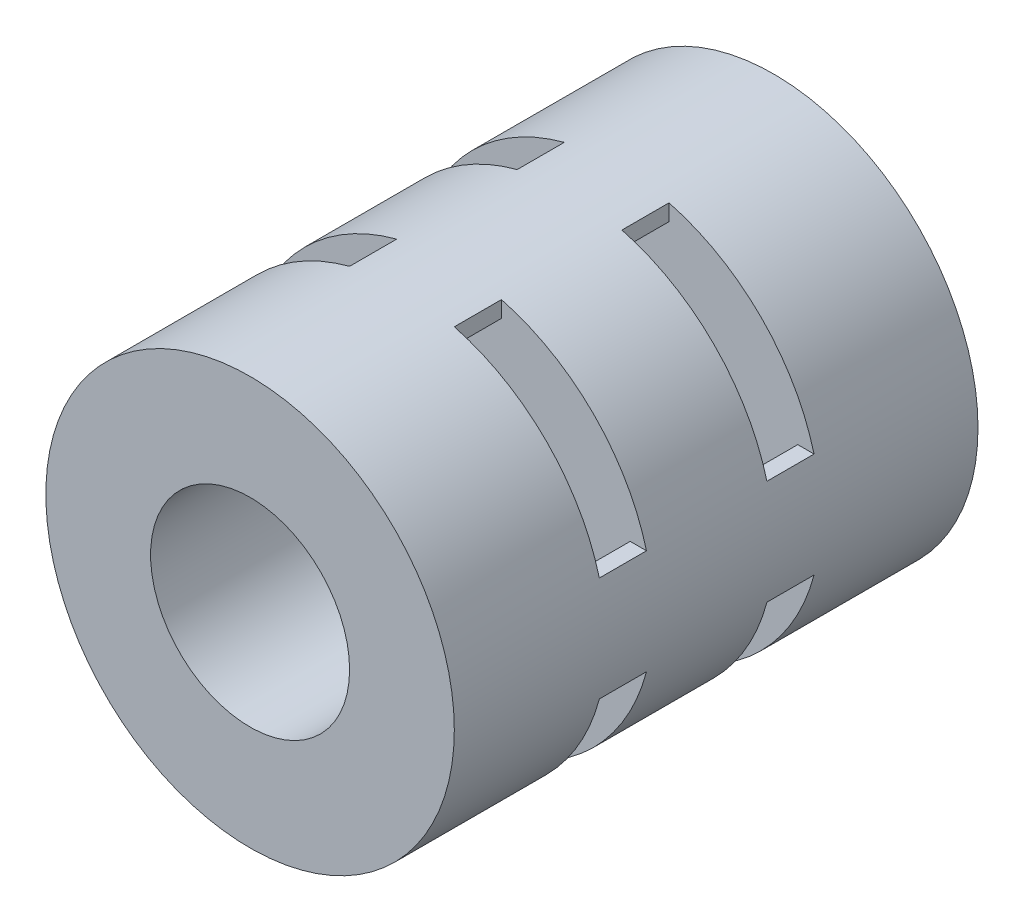
ISO-10303-21;
HEADER;
FILE_DESCRIPTION(('STEP AP214'),'2;1');
FILE_NAME('part.step','',(''),(''),'','','');
FILE_SCHEMA(('AUTOMOTIVE_DESIGN { 1 0 10303 214 1 1 1 1 }'));
ENDSEC;
DATA;
#1=APPLICATION_CONTEXT('core data for automotive mechanical design processes');
#2=APPLICATION_PROTOCOL_DEFINITION('international standard','automotive_design',2000,#1);
#3=PRODUCT_CONTEXT('',#1,'mechanical');
#4=PRODUCT('Part','Part','',(#3));
#5=PRODUCT_RELATED_PRODUCT_CATEGORY('part','',(#4));
#6=PRODUCT_DEFINITION_FORMATION('','',#4);
#7=PRODUCT_DEFINITION_CONTEXT('part definition',#1,'design');
#8=PRODUCT_DEFINITION('design','',#6,#7);
#9=PRODUCT_DEFINITION_SHAPE('','',#8);
#10=(LENGTH_UNIT() NAMED_UNIT(*) SI_UNIT(.MILLI.,.METRE.));
#11=(NAMED_UNIT(*) PLANE_ANGLE_UNIT() SI_UNIT($,.RADIAN.));
#12=(NAMED_UNIT(*) SI_UNIT($,.STERADIAN.) SOLID_ANGLE_UNIT());
#13=UNCERTAINTY_MEASURE_WITH_UNIT(LENGTH_MEASURE(1.E-05),#10,'distance_accuracy_value','');
#14=(GEOMETRIC_REPRESENTATION_CONTEXT(3) GLOBAL_UNCERTAINTY_ASSIGNED_CONTEXT((#13)) GLOBAL_UNIT_ASSIGNED_CONTEXT((#10,
#11,#12)) REPRESENTATION_CONTEXT('',''));
#15=CARTESIAN_POINT('',(0.,0.,0.));
#16=DIRECTION('',(0.,0.,1.));
#17=DIRECTION('',(1.,0.,0.));
#18=AXIS2_PLACEMENT_3D('',#15,#16,#17);
#19=CARTESIAN_POINT('',(0.,0.,15.));
#20=DIRECTION('',(0.,0.,1.));
#21=DIRECTION('',(1.,0.,0.));
#22=AXIS2_PLACEMENT_3D('',#19,#20,#21);
#23=PLANE('',#22);
#24=CARTESIAN_POINT('',(0.,0.,15.));
#25=DIRECTION('',(0.,0.,1.));
#26=DIRECTION('',(1.,0.,0.));
#27=AXIS2_PLACEMENT_3D('',#24,#25,#26);
#28=CIRCLE('',#27,6.);
#29=CARTESIAN_POINT('',(6.,0.,15.));
#30=VERTEX_POINT('',#29);
#31=EDGE_CURVE('E896',#30,#30,#28,.T.);
#32=ORIENTED_EDGE('',*,*,#31,.F.);
#33=EDGE_LOOP('',(#32));
#34=FACE_BOUND('',#33,.T.);
#35=CARTESIAN_POINT('',(0.,0.,15.));
#36=DIRECTION('',(0.,0.,1.));
#37=DIRECTION('',(1.,0.,0.));
#38=AXIS2_PLACEMENT_3D('',#35,#36,#37);
#39=CIRCLE('',#38,19.5);
#40=CARTESIAN_POINT('',(18.8480768249708,5.,15.));
#41=VERTEX_POINT('',#40);
#42=CARTESIAN_POINT('',(5.00000000000007,18.8480768249708,15.));
#43=VERTEX_POINT('',#42);
#44=EDGE_CURVE('E11',#41,#43,#39,.T.);
#45=ORIENTED_EDGE('',*,*,#44,.T.);
#46=DIRECTION('',(0.,1.,0.));
#47=VECTOR('',#46,1.);
#48=CARTESIAN_POINT('',(5.00000000000006,17.2916164657905,15.));
#49=LINE('',#48,#47);
#50=CARTESIAN_POINT('',(5.00000000000006,17.2916164657905,15.));
#51=VERTEX_POINT('',#50);
#52=EDGE_CURVE('E755',#51,#43,#49,.T.);
#53=ORIENTED_EDGE('',*,*,#52,.F.);
#54=CARTESIAN_POINT('',(0.,0.,15.));
#55=DIRECTION('',(0.,0.,-1.));
#56=DIRECTION('',(0.,-1.,0.));
#57=AXIS2_PLACEMENT_3D('',#54,#55,#56);
#58=CIRCLE('',#57,18.);
#59=CARTESIAN_POINT('',(-4.99999999999994,17.2916164657906,15.));
#60=VERTEX_POINT('',#59);
#61=EDGE_CURVE('E752',#60,#51,#58,.T.);
#62=ORIENTED_EDGE('',*,*,#61,.F.);
#63=DIRECTION('',(0.,-1.,0.));
#64=VECTOR('',#63,1.);
#65=CARTESIAN_POINT('',(-4.99999999999994,17.2916164657906,15.));
#66=LINE('',#65,#64);
#67=CARTESIAN_POINT('',(-4.99999999999993,18.8480768249708,15.));
#68=VERTEX_POINT('',#67);
#69=EDGE_CURVE('E745',#68,#60,#66,.T.);
#70=ORIENTED_EDGE('',*,*,#69,.F.);
#71=CARTESIAN_POINT('',(-18.8480768249708,5.,15.));
#72=VERTEX_POINT('',#71);
#73=EDGE_CURVE('E27',#68,#72,#39,.T.);
#74=ORIENTED_EDGE('',*,*,#73,.T.);
#75=DIRECTION('',(-1.,0.,0.));
#76=VECTOR('',#75,1.);
#77=CARTESIAN_POINT('',(-17.2916164657906,5.,15.));
#78=LINE('',#77,#76);
#79=CARTESIAN_POINT('',(-17.2916164657906,5.,15.));
#80=VERTEX_POINT('',#79);
#81=EDGE_CURVE('E815',#80,#72,#78,.T.);
#82=ORIENTED_EDGE('',*,*,#81,.F.);
#83=CARTESIAN_POINT('',(0.,0.,15.));
#84=DIRECTION('',(0.,0.,-1.));
#85=DIRECTION('',(1.,0.,0.));
#86=AXIS2_PLACEMENT_3D('',#83,#84,#85);
#87=CIRCLE('',#86,18.);
#88=CARTESIAN_POINT('',(-17.2916164657906,-5.,15.));
#89=VERTEX_POINT('',#88);
#90=EDGE_CURVE('E801',#89,#80,#87,.T.);
#91=ORIENTED_EDGE('',*,*,#90,.F.);
#92=DIRECTION('',(1.,0.,0.));
#93=VECTOR('',#92,1.);
#94=CARTESIAN_POINT('',(-17.2916164657906,-5.,15.));
#95=LINE('',#94,#93);
#96=CARTESIAN_POINT('',(-18.8480768249708,-5.,15.));
#97=VERTEX_POINT('',#96);
#98=EDGE_CURVE('E806',#97,#89,#95,.T.);
#99=ORIENTED_EDGE('',*,*,#98,.F.);
#100=CARTESIAN_POINT('',(-5.00000000000007,-18.8480768249708,15.));
#101=VERTEX_POINT('',#100);
#102=EDGE_CURVE('E869',#97,#101,#39,.T.);
#103=ORIENTED_EDGE('',*,*,#102,.T.);
#104=DIRECTION('',(0.,-1.,0.));
#105=VECTOR('',#104,1.);
#106=CARTESIAN_POINT('',(-5.00000000000007,-18.8480768249708,15.));
#107=LINE('',#106,#105);
#108=CARTESIAN_POINT('',(-5.00000000000006,-17.2916164657905,15.));
#109=VERTEX_POINT('',#108);
#110=EDGE_CURVE('E785',#109,#101,#107,.T.);
#111=ORIENTED_EDGE('',*,*,#110,.F.);
#112=CARTESIAN_POINT('',(0.,0.,15.));
#113=DIRECTION('',(0.,0.,-1.));
#114=DIRECTION('',(0.,-1.,0.));
#115=AXIS2_PLACEMENT_3D('',#112,#113,#114);
#116=CIRCLE('',#115,18.);
#117=CARTESIAN_POINT('',(4.99999999999994,-17.2916164657906,15.));
#118=VERTEX_POINT('',#117);
#119=EDGE_CURVE('E771',#118,#109,#116,.T.);
#120=ORIENTED_EDGE('',*,*,#119,.F.);
#121=DIRECTION('',(0.,1.,0.));
#122=VECTOR('',#121,1.);
#123=CARTESIAN_POINT('',(4.99999999999993,-18.8480768249708,15.));
#124=LINE('',#123,#122);
#125=CARTESIAN_POINT('',(4.99999999999993,-18.8480768249708,15.));
#126=VERTEX_POINT('',#125);
#127=EDGE_CURVE('E776',#126,#118,#124,.T.);
#128=ORIENTED_EDGE('',*,*,#127,.F.);
#129=CARTESIAN_POINT('',(18.8480768249708,-5.,15.));
#130=VERTEX_POINT('',#129);
#131=EDGE_CURVE('E871',#126,#130,#39,.T.);
#132=ORIENTED_EDGE('',*,*,#131,.T.);
#133=DIRECTION('',(1.,0.,0.));
#134=VECTOR('',#133,1.);
#135=CARTESIAN_POINT('',(18.8480768249708,-5.,15.));
#136=LINE('',#135,#134);
#137=CARTESIAN_POINT('',(17.2916164657906,-5.,15.));
#138=VERTEX_POINT('',#137);
#139=EDGE_CURVE('E845',#138,#130,#136,.T.);
#140=ORIENTED_EDGE('',*,*,#139,.F.);
#141=CARTESIAN_POINT('',(0.,0.,15.));
#142=DIRECTION('',(0.,0.,-1.));
#143=DIRECTION('',(1.,0.,0.));
#144=AXIS2_PLACEMENT_3D('',#141,#142,#143);
#145=CIRCLE('',#144,18.);
#146=CARTESIAN_POINT('',(17.2916164657906,5.,15.));
#147=VERTEX_POINT('',#146);
#148=EDGE_CURVE('E831',#147,#138,#145,.T.);
#149=ORIENTED_EDGE('',*,*,#148,.F.);
#150=DIRECTION('',(-1.,0.,0.));
#151=VECTOR('',#150,1.);
#152=CARTESIAN_POINT('',(18.8480768249708,5.,15.));
#153=LINE('',#152,#151);
#154=EDGE_CURVE('E836',#41,#147,#153,.T.);
#155=ORIENTED_EDGE('',*,*,#154,.F.);
#156=EDGE_LOOP('',(#45,#53,#62,#70,#74,#82,#91,#99,#103,#111,#120,#128,#132,#140,#149,#155));
#157=FACE_BOUND('',#156,.T.);
#158=ADVANCED_FACE('F17',(#34,#157),#23,.T.);
#159=CARTESIAN_POINT('',(0.,0.,0.));
#160=DIRECTION('',(0.,0.,1.));
#161=DIRECTION('',(1.,0.,0.));
#162=AXIS2_PLACEMENT_3D('',#159,#160,#161);
#163=PLANE('',#162);
#164=CARTESIAN_POINT('',(0.,0.,0.));
#165=DIRECTION('',(0.,0.,1.));
#166=DIRECTION('',(1.,0.,0.));
#167=AXIS2_PLACEMENT_3D('',#164,#165,#166);
#168=CIRCLE('',#167,19.5);
#169=CARTESIAN_POINT('',(19.5,0.,0.));
#170=VERTEX_POINT('',#169);
#171=EDGE_CURVE('E872',#170,#170,#168,.T.);
#172=ORIENTED_EDGE('',*,*,#171,.F.);
#173=EDGE_LOOP('',(#172));
#174=FACE_BOUND('',#173,.T.);
#175=CARTESIAN_POINT('',(0.,0.,0.));
#176=DIRECTION('',(0.,0.,1.));
#177=DIRECTION('',(1.,0.,0.));
#178=AXIS2_PLACEMENT_3D('',#175,#176,#177);
#179=CIRCLE('',#178,6.);
#180=CARTESIAN_POINT('',(6.,0.,0.));
#181=VERTEX_POINT('',#180);
#182=EDGE_CURVE('E894',#181,#181,#179,.T.);
#183=ORIENTED_EDGE('',*,*,#182,.T.);
#184=EDGE_LOOP('',(#183));
#185=FACE_BOUND('',#184,.T.);
#186=ADVANCED_FACE('F293',(#174,#185),#163,.F.);
#187=CARTESIAN_POINT('',(0.,0.,15.));
#188=DIRECTION('',(0.,0.,-1.));
#189=DIRECTION('',(-1.,0.,0.));
#190=AXIS2_PLACEMENT_3D('',#187,#188,#189);
#191=CYLINDRICAL_SURFACE('',#190,19.5);
#192=DIRECTION('',(0.,0.,1.));
#193=VECTOR('',#192,1.);
#194=CARTESIAN_POINT('',(18.8480768249708,5.,31.));
#195=LINE('',#194,#193);
#196=CARTESIAN_POINT('',(18.8480768249708,5.,31.));
#197=VERTEX_POINT('',#196);
#198=CARTESIAN_POINT('',(18.8480768249708,5.,35.5));
#199=VERTEX_POINT('',#198);
#200=EDGE_CURVE('E231',#197,#199,#195,.T.);
#201=ORIENTED_EDGE('',*,*,#200,.T.);
#202=CARTESIAN_POINT('',(0.,0.,35.5));
#203=DIRECTION('',(0.,0.,1.));
#204=DIRECTION('',(1.,0.,0.));
#205=AXIS2_PLACEMENT_3D('',#202,#203,#204);
#206=CIRCLE('',#205,19.5);
#207=CARTESIAN_POINT('',(5.00000000000007,18.8480768249708,35.5));
#208=VERTEX_POINT('',#207);
#209=EDGE_CURVE('E246',#199,#208,#206,.T.);
#210=ORIENTED_EDGE('',*,*,#209,.T.);
#211=DIRECTION('',(0.,0.,1.));
#212=VECTOR('',#211,1.);
#213=CARTESIAN_POINT('',(5.00000000000007,18.8480768249708,31.));
#214=LINE('',#213,#212);
#215=CARTESIAN_POINT('',(5.00000000000007,18.8480768249708,31.));
#216=VERTEX_POINT('',#215);
#217=EDGE_CURVE('E625',#216,#208,#214,.T.);
#218=ORIENTED_EDGE('',*,*,#217,.F.);
#219=CARTESIAN_POINT('',(0.,0.,31.));
#220=DIRECTION('',(0.,0.,1.));
#221=DIRECTION('',(1.,0.,0.));
#222=AXIS2_PLACEMENT_3D('',#219,#220,#221);
#223=CIRCLE('',#222,19.5);
#224=EDGE_CURVE('E247',#197,#216,#223,.T.);
#225=ORIENTED_EDGE('',*,*,#224,.F.);
#226=EDGE_LOOP('',(#201,#210,#218,#225));
#227=FACE_BOUND('',#226,.T.);
#228=DIRECTION('',(0.,0.,1.));
#229=VECTOR('',#228,1.);
#230=CARTESIAN_POINT('',(-18.8480768249708,-5.,31.));
#231=LINE('',#230,#229);
#232=CARTESIAN_POINT('',(-18.8480768249708,-5.,31.));
#233=VERTEX_POINT('',#232);
#234=CARTESIAN_POINT('',(-18.8480768249708,-5.,35.5));
#235=VERTEX_POINT('',#234);
#236=EDGE_CURVE('E691',#233,#235,#231,.T.);
#237=ORIENTED_EDGE('',*,*,#236,.T.);
#238=CARTESIAN_POINT('',(-5.00000000000007,-18.8480768249708,35.5));
#239=VERTEX_POINT('',#238);
#240=EDGE_CURVE('E264',#235,#239,#206,.T.);
#241=ORIENTED_EDGE('',*,*,#240,.T.);
#242=DIRECTION('',(0.,0.,1.));
#243=VECTOR('',#242,1.);
#244=CARTESIAN_POINT('',(-5.00000000000007,-18.8480768249708,31.));
#245=LINE('',#244,#243);
#246=CARTESIAN_POINT('',(-5.00000000000007,-18.8480768249708,31.));
#247=VERTEX_POINT('',#246);
#248=EDGE_CURVE('E663',#247,#239,#245,.T.);
#249=ORIENTED_EDGE('',*,*,#248,.F.);
#250=EDGE_CURVE('E715',#233,#247,#223,.T.);
#251=ORIENTED_EDGE('',*,*,#250,.F.);
#252=EDGE_LOOP('',(#237,#241,#249,#251));
#253=FACE_BOUND('',#252,.T.);
#254=DIRECTION('',(0.,0.,1.));
#255=VECTOR('',#254,1.);
#256=CARTESIAN_POINT('',(4.99999999999993,-18.8480768249708,31.));
#257=LINE('',#256,#255);
#258=CARTESIAN_POINT('',(4.99999999999993,-18.8480768249708,31.));
#259=VERTEX_POINT('',#258);
#260=CARTESIAN_POINT('',(4.99999999999993,-18.8480768249708,35.5));
#261=VERTEX_POINT('',#260);
#262=EDGE_CURVE('E665',#259,#261,#257,.T.);
#263=ORIENTED_EDGE('',*,*,#262,.T.);
#264=CARTESIAN_POINT('',(18.8480768249708,-5.,35.5));
#265=VERTEX_POINT('',#264);
#266=EDGE_CURVE('E259',#261,#265,#206,.T.);
#267=ORIENTED_EDGE('',*,*,#266,.T.);
#268=DIRECTION('',(0.,0.,1.));
#269=VECTOR('',#268,1.);
#270=CARTESIAN_POINT('',(18.8480768249708,-5.,31.));
#271=LINE('',#270,#269);
#272=CARTESIAN_POINT('',(18.8480768249708,-5.,31.));
#273=VERTEX_POINT('',#272);
#274=EDGE_CURVE('E248',#273,#265,#271,.T.);
#275=ORIENTED_EDGE('',*,*,#274,.F.);
#276=EDGE_CURVE('E716',#259,#273,#223,.T.);
#277=ORIENTED_EDGE('',*,*,#276,.F.);
#278=EDGE_LOOP('',(#263,#267,#275,#277));
#279=FACE_BOUND('',#278,.T.);
#280=DIRECTION('',(0.,0.,-1.));
#281=VECTOR('',#280,1.);
#282=CARTESIAN_POINT('',(18.8480768249708,5.,19.5));
#283=LINE('',#282,#281);
#284=CARTESIAN_POINT('',(18.8480768249708,5.,19.5));
#285=VERTEX_POINT('',#284);
#286=EDGE_CURVE('E858',#285,#41,#283,.T.);
#287=ORIENTED_EDGE('',*,*,#286,.F.);
#288=CARTESIAN_POINT('',(0.,0.,19.5));
#289=DIRECTION('',(0.,0.,1.));
#290=DIRECTION('',(1.,0.,0.));
#291=AXIS2_PLACEMENT_3D('',#288,#289,#290);
#292=CIRCLE('',#291,19.5);
#293=CARTESIAN_POINT('',(5.00000000000007,18.8480768249708,19.5));
#294=VERTEX_POINT('',#293);
#295=EDGE_CURVE('E737',#285,#294,#292,.T.);
#296=ORIENTED_EDGE('',*,*,#295,.T.);
#297=DIRECTION('',(0.,0.,-1.));
#298=VECTOR('',#297,1.);
#299=CARTESIAN_POINT('',(5.00000000000007,18.8480768249708,19.5));
#300=LINE('',#299,#298);
#301=EDGE_CURVE('E765',#294,#43,#300,.T.);
#302=ORIENTED_EDGE('',*,*,#301,.T.);
#303=ORIENTED_EDGE('',*,*,#44,.F.);
#304=EDGE_LOOP('',(#287,#296,#302,#303));
#305=FACE_BOUND('',#304,.T.);
#306=DIRECTION('',(0.,0.,-1.));
#307=VECTOR('',#306,1.);
#308=CARTESIAN_POINT('',(-18.8480768249708,-5.,19.5));
#309=LINE('',#308,#307);
#310=CARTESIAN_POINT('',(-18.8480768249708,-5.,19.5));
#311=VERTEX_POINT('',#310);
#312=EDGE_CURVE('E822',#311,#97,#309,.T.);
#313=ORIENTED_EDGE('',*,*,#312,.F.);
#314=CARTESIAN_POINT('',(-5.00000000000007,-18.8480768249708,19.5));
#315=VERTEX_POINT('',#314);
#316=EDGE_CURVE('E881',#311,#315,#292,.T.);
#317=ORIENTED_EDGE('',*,*,#316,.T.);
#318=DIRECTION('',(0.,0.,-1.));
#319=VECTOR('',#318,1.);
#320=CARTESIAN_POINT('',(-5.00000000000007,-18.8480768249708,19.5));
#321=LINE('',#320,#319);
#322=EDGE_CURVE('E795',#315,#101,#321,.T.);
#323=ORIENTED_EDGE('',*,*,#322,.T.);
#324=ORIENTED_EDGE('',*,*,#102,.F.);
#325=EDGE_LOOP('',(#313,#317,#323,#324));
#326=FACE_BOUND('',#325,.T.);
#327=DIRECTION('',(0.,0.,-1.));
#328=VECTOR('',#327,1.);
#329=CARTESIAN_POINT('',(4.99999999999993,-18.8480768249708,19.5));
#330=LINE('',#329,#328);
#331=CARTESIAN_POINT('',(4.99999999999993,-18.8480768249708,19.5));
#332=VERTEX_POINT('',#331);
#333=EDGE_CURVE('E792',#332,#126,#330,.T.);
#334=ORIENTED_EDGE('',*,*,#333,.F.);
#335=CARTESIAN_POINT('',(18.8480768249708,-5.,19.5));
#336=VERTEX_POINT('',#335);
#337=EDGE_CURVE('E734',#332,#336,#292,.T.);
#338=ORIENTED_EDGE('',*,*,#337,.T.);
#339=DIRECTION('',(0.,0.,-1.));
#340=VECTOR('',#339,1.);
#341=CARTESIAN_POINT('',(18.8480768249708,-5.,19.5));
#342=LINE('',#341,#340);
#343=EDGE_CURVE('E854',#336,#130,#342,.T.);
#344=ORIENTED_EDGE('',*,*,#343,.T.);
#345=ORIENTED_EDGE('',*,*,#131,.F.);
#346=EDGE_LOOP('',(#334,#338,#344,#345));
#347=FACE_BOUND('',#346,.T.);
#348=CARTESIAN_POINT('',(-4.99999999999993,18.8480768249708,19.5));
#349=VERTEX_POINT('',#348);
#350=CARTESIAN_POINT('',(-18.8480768249708,5.,19.5));
#351=VERTEX_POINT('',#350);
#352=EDGE_CURVE('E740',#349,#351,#292,.T.);
#353=ORIENTED_EDGE('',*,*,#352,.T.);
#354=DIRECTION('',(0.,0.,-1.));
#355=VECTOR('',#354,1.);
#356=CARTESIAN_POINT('',(-18.8480768249708,5.,19.5));
#357=LINE('',#356,#355);
#358=EDGE_CURVE('E825',#351,#72,#357,.T.);
#359=ORIENTED_EDGE('',*,*,#358,.T.);
#360=ORIENTED_EDGE('',*,*,#73,.F.);
#361=DIRECTION('',(0.,0.,-1.));
#362=VECTOR('',#361,1.);
#363=CARTESIAN_POINT('',(-4.99999999999993,18.8480768249708,19.5));
#364=LINE('',#363,#362);
#365=EDGE_CURVE('E762',#349,#68,#364,.T.);
#366=ORIENTED_EDGE('',*,*,#365,.F.);
#367=EDGE_LOOP('',(#353,#359,#360,#366));
#368=FACE_BOUND('',#367,.T.);
#369=ORIENTED_EDGE('',*,*,#171,.T.);
#370=EDGE_LOOP('',(#369));
#371=FACE_BOUND('',#370,.T.);
#372=CARTESIAN_POINT('',(-4.99999999999993,18.8480768249708,35.5));
#373=VERTEX_POINT('',#372);
#374=CARTESIAN_POINT('',(-18.8480768249708,5.,35.5));
#375=VERTEX_POINT('',#374);
#376=EDGE_CURVE('E257',#373,#375,#206,.T.);
#377=ORIENTED_EDGE('',*,*,#376,.T.);
#378=DIRECTION('',(0.,0.,1.));
#379=VECTOR('',#378,1.);
#380=CARTESIAN_POINT('',(-18.8480768249708,5.,31.));
#381=LINE('',#380,#379);
#382=CARTESIAN_POINT('',(-18.8480768249708,5.,31.));
#383=VERTEX_POINT('',#382);
#384=EDGE_CURVE('E689',#383,#375,#381,.T.);
#385=ORIENTED_EDGE('',*,*,#384,.F.);
#386=CARTESIAN_POINT('',(-4.99999999999993,18.8480768249708,31.));
#387=VERTEX_POINT('',#386);
#388=EDGE_CURVE('E21',#387,#383,#223,.T.);
#389=ORIENTED_EDGE('',*,*,#388,.F.);
#390=DIRECTION('',(0.,0.,1.));
#391=VECTOR('',#390,1.);
#392=CARTESIAN_POINT('',(-4.99999999999993,18.8480768249708,31.));
#393=LINE('',#392,#391);
#394=EDGE_CURVE('E638',#387,#373,#393,.T.);
#395=ORIENTED_EDGE('',*,*,#394,.T.);
#396=EDGE_LOOP('',(#377,#385,#389,#395));
#397=FACE_BOUND('',#396,.T.);
#398=CARTESIAN_POINT('',(0.,0.,50.));
#399=DIRECTION('',(0.,0.,1.));
#400=DIRECTION('',(1.,0.,0.));
#401=AXIS2_PLACEMENT_3D('',#398,#399,#400);
#402=CIRCLE('',#401,19.5);
#403=CARTESIAN_POINT('',(19.5,0.,50.));
#404=VERTEX_POINT('',#403);
#405=EDGE_CURVE('E256',#404,#404,#402,.T.);
#406=ORIENTED_EDGE('',*,*,#405,.F.);
#407=EDGE_LOOP('',(#406));
#408=FACE_BOUND('',#407,.T.);
#409=ADVANCED_FACE('F19',(#227,#253,#279,#305,#326,#347,#368,#371,#397,#408),#191,.T.);
#410=CARTESIAN_POINT('',(0.,0.,15.));
#411=DIRECTION('',(0.,0.,-1.));
#412=DIRECTION('',(-1.,0.,0.));
#413=AXIS2_PLACEMENT_3D('',#410,#411,#412);
#414=CYLINDRICAL_SURFACE('',#413,6.);
#415=ORIENTED_EDGE('',*,*,#31,.T.);
#416=EDGE_LOOP('',(#415));
#417=FACE_BOUND('',#416,.T.);
#418=ORIENTED_EDGE('',*,*,#182,.F.);
#419=EDGE_LOOP('',(#418));
#420=FACE_BOUND('',#419,.T.);
#421=ADVANCED_FACE('F303',(#417,#420),#414,.F.);
#422=CARTESIAN_POINT('',(0.,0.,19.5));
#423=DIRECTION('',(0.,0.,-1.));
#424=DIRECTION('',(-1.,0.,0.));
#425=AXIS2_PLACEMENT_3D('',#422,#423,#424);
#426=CYLINDRICAL_SURFACE('',#425,18.);
#427=ORIENTED_EDGE('',*,*,#148,.T.);
#428=DIRECTION('',(0.,0.,-1.));
#429=VECTOR('',#428,1.);
#430=CARTESIAN_POINT('',(17.2916164657906,-5.,19.5));
#431=LINE('',#430,#429);
#432=CARTESIAN_POINT('',(17.2916164657906,-5.,19.5));
#433=VERTEX_POINT('',#432);
#434=EDGE_CURVE('E857',#433,#138,#431,.T.);
#435=ORIENTED_EDGE('',*,*,#434,.F.);
#436=CARTESIAN_POINT('',(0.,0.,19.5));
#437=DIRECTION('',(0.,0.,-1.));
#438=DIRECTION('',(1.,0.,0.));
#439=AXIS2_PLACEMENT_3D('',#436,#437,#438);
#440=CIRCLE('',#439,18.);
#441=CARTESIAN_POINT('',(17.2916164657906,5.,19.5));
#442=VERTEX_POINT('',#441);
#443=EDGE_CURVE('E832',#442,#433,#440,.T.);
#444=ORIENTED_EDGE('',*,*,#443,.F.);
#445=DIRECTION('',(0.,0.,-1.));
#446=VECTOR('',#445,1.);
#447=CARTESIAN_POINT('',(17.2916164657906,5.,19.5));
#448=LINE('',#447,#446);
#449=EDGE_CURVE('E842',#442,#147,#448,.T.);
#450=ORIENTED_EDGE('',*,*,#449,.T.);
#451=EDGE_LOOP('',(#427,#435,#444,#450));
#452=FACE_BOUND('',#451,.T.);
#453=ADVANCED_FACE('F306',(#452),#426,.F.);
#454=CARTESIAN_POINT('',(18.8480768249708,-5.,19.5));
#455=DIRECTION('',(0.,1.,0.));
#456=DIRECTION('',(0.,0.,1.));
#457=AXIS2_PLACEMENT_3D('',#454,#455,#456);
#458=PLANE('',#457);
#459=ORIENTED_EDGE('',*,*,#139,.T.);
#460=ORIENTED_EDGE('',*,*,#343,.F.);
#461=DIRECTION('',(1.,0.,0.));
#462=VECTOR('',#461,1.);
#463=CARTESIAN_POINT('',(18.8480768249708,-5.,19.5));
#464=LINE('',#463,#462);
#465=EDGE_CURVE('E835',#433,#336,#464,.T.);
#466=ORIENTED_EDGE('',*,*,#465,.F.);
#467=ORIENTED_EDGE('',*,*,#434,.T.);
#468=EDGE_LOOP('',(#459,#460,#466,#467));
#469=FACE_BOUND('',#468,.T.);
#470=ADVANCED_FACE('F310',(#469),#458,.F.);
#471=CARTESIAN_POINT('',(18.8480768249708,5.,19.5));
#472=DIRECTION('',(0.,-1.,0.));
#473=DIRECTION('',(0.,0.,-1.));
#474=AXIS2_PLACEMENT_3D('',#471,#472,#473);
#475=PLANE('',#474);
#476=ORIENTED_EDGE('',*,*,#154,.T.);
#477=ORIENTED_EDGE('',*,*,#449,.F.);
#478=DIRECTION('',(-1.,0.,0.));
#479=VECTOR('',#478,1.);
#480=CARTESIAN_POINT('',(18.8480768249708,5.,19.5));
#481=LINE('',#480,#479);
#482=EDGE_CURVE('E839',#285,#442,#481,.T.);
#483=ORIENTED_EDGE('',*,*,#482,.F.);
#484=ORIENTED_EDGE('',*,*,#286,.T.);
#485=EDGE_LOOP('',(#476,#477,#483,#484));
#486=FACE_BOUND('',#485,.T.);
#487=ADVANCED_FACE('F314',(#486),#475,.F.);
#488=CARTESIAN_POINT('',(0.,0.,19.5));
#489=DIRECTION('',(0.,0.,-1.));
#490=DIRECTION('',(-1.,0.,0.));
#491=AXIS2_PLACEMENT_3D('',#488,#489,#490);
#492=CYLINDRICAL_SURFACE('',#491,18.);
#493=ORIENTED_EDGE('',*,*,#90,.T.);
#494=DIRECTION('',(0.,0.,-1.));
#495=VECTOR('',#494,1.);
#496=CARTESIAN_POINT('',(-17.2916164657906,5.,19.5));
#497=LINE('',#496,#495);
#498=CARTESIAN_POINT('',(-17.2916164657906,5.,19.5));
#499=VERTEX_POINT('',#498);
#500=EDGE_CURVE('E828',#499,#80,#497,.T.);
#501=ORIENTED_EDGE('',*,*,#500,.F.);
#502=CARTESIAN_POINT('',(0.,0.,19.5));
#503=DIRECTION('',(0.,0.,-1.));
#504=DIRECTION('',(1.,0.,0.));
#505=AXIS2_PLACEMENT_3D('',#502,#503,#504);
#506=CIRCLE('',#505,18.);
#507=CARTESIAN_POINT('',(-17.2916164657906,-5.,19.5));
#508=VERTEX_POINT('',#507);
#509=EDGE_CURVE('E802',#508,#499,#506,.T.);
#510=ORIENTED_EDGE('',*,*,#509,.F.);
#511=DIRECTION('',(0.,0.,-1.));
#512=VECTOR('',#511,1.);
#513=CARTESIAN_POINT('',(-17.2916164657906,-5.,19.5));
#514=LINE('',#513,#512);
#515=EDGE_CURVE('E812',#508,#89,#514,.T.);
#516=ORIENTED_EDGE('',*,*,#515,.T.);
#517=EDGE_LOOP('',(#493,#501,#510,#516));
#518=FACE_BOUND('',#517,.T.);
#519=ADVANCED_FACE('F318',(#518),#492,.F.);
#520=CARTESIAN_POINT('',(-17.2916164657906,5.,19.5));
#521=DIRECTION('',(0.,-1.,0.));
#522=DIRECTION('',(0.,0.,-1.));
#523=AXIS2_PLACEMENT_3D('',#520,#521,#522);
#524=PLANE('',#523);
#525=ORIENTED_EDGE('',*,*,#81,.T.);
#526=ORIENTED_EDGE('',*,*,#358,.F.);
#527=DIRECTION('',(-1.,0.,0.));
#528=VECTOR('',#527,1.);
#529=CARTESIAN_POINT('',(-17.2916164657906,5.,19.5));
#530=LINE('',#529,#528);
#531=EDGE_CURVE('E805',#499,#351,#530,.T.);
#532=ORIENTED_EDGE('',*,*,#531,.F.);
#533=ORIENTED_EDGE('',*,*,#500,.T.);
#534=EDGE_LOOP('',(#525,#526,#532,#533));
#535=FACE_BOUND('',#534,.T.);
#536=ADVANCED_FACE('F322',(#535),#524,.F.);
#537=CARTESIAN_POINT('',(-17.2916164657906,-5.,19.5));
#538=DIRECTION('',(0.,1.,0.));
#539=DIRECTION('',(0.,0.,1.));
#540=AXIS2_PLACEMENT_3D('',#537,#538,#539);
#541=PLANE('',#540);
#542=ORIENTED_EDGE('',*,*,#98,.T.);
#543=ORIENTED_EDGE('',*,*,#515,.F.);
#544=DIRECTION('',(1.,0.,0.));
#545=VECTOR('',#544,1.);
#546=CARTESIAN_POINT('',(-17.2916164657906,-5.,19.5));
#547=LINE('',#546,#545);
#548=EDGE_CURVE('E809',#311,#508,#547,.T.);
#549=ORIENTED_EDGE('',*,*,#548,.F.);
#550=ORIENTED_EDGE('',*,*,#312,.T.);
#551=EDGE_LOOP('',(#542,#543,#549,#550));
#552=FACE_BOUND('',#551,.T.);
#553=ADVANCED_FACE('F326',(#552),#541,.F.);
#554=CARTESIAN_POINT('',(0.,0.,19.5));
#555=DIRECTION('',(0.,0.,-1.));
#556=DIRECTION('',(-1.,0.,0.));
#557=AXIS2_PLACEMENT_3D('',#554,#555,#556);
#558=CYLINDRICAL_SURFACE('',#557,18.);
#559=ORIENTED_EDGE('',*,*,#119,.T.);
#560=DIRECTION('',(0.,0.,-1.));
#561=VECTOR('',#560,1.);
#562=CARTESIAN_POINT('',(-5.00000000000006,-17.2916164657905,19.5));
#563=LINE('',#562,#561);
#564=CARTESIAN_POINT('',(-5.00000000000006,-17.2916164657905,19.5));
#565=VERTEX_POINT('',#564);
#566=EDGE_CURVE('E798',#565,#109,#563,.T.);
#567=ORIENTED_EDGE('',*,*,#566,.F.);
#568=CARTESIAN_POINT('',(0.,0.,19.5));
#569=DIRECTION('',(0.,0.,-1.));
#570=DIRECTION('',(0.,-1.,0.));
#571=AXIS2_PLACEMENT_3D('',#568,#569,#570);
#572=CIRCLE('',#571,18.);
#573=CARTESIAN_POINT('',(4.99999999999994,-17.2916164657906,19.5));
#574=VERTEX_POINT('',#573);
#575=EDGE_CURVE('E772',#574,#565,#572,.T.);
#576=ORIENTED_EDGE('',*,*,#575,.F.);
#577=DIRECTION('',(0.,0.,-1.));
#578=VECTOR('',#577,1.);
#579=CARTESIAN_POINT('',(4.99999999999994,-17.2916164657906,19.5));
#580=LINE('',#579,#578);
#581=EDGE_CURVE('E782',#574,#118,#580,.T.);
#582=ORIENTED_EDGE('',*,*,#581,.T.);
#583=EDGE_LOOP('',(#559,#567,#576,#582));
#584=FACE_BOUND('',#583,.T.);
#585=ADVANCED_FACE('F330',(#584),#558,.F.);
#586=CARTESIAN_POINT('',(-5.00000000000007,-18.8480768249708,19.5));
#587=DIRECTION('',(1.,0.,0.));
#588=DIRECTION('',(0.,1.,0.));
#589=AXIS2_PLACEMENT_3D('',#586,#587,#588);
#590=PLANE('',#589);
#591=ORIENTED_EDGE('',*,*,#110,.T.);
#592=ORIENTED_EDGE('',*,*,#322,.F.);
#593=DIRECTION('',(0.,-1.,0.));
#594=VECTOR('',#593,1.);
#595=CARTESIAN_POINT('',(-5.00000000000007,-18.8480768249708,19.5));
#596=LINE('',#595,#594);
#597=EDGE_CURVE('E775',#565,#315,#596,.T.);
#598=ORIENTED_EDGE('',*,*,#597,.F.);
#599=ORIENTED_EDGE('',*,*,#566,.T.);
#600=EDGE_LOOP('',(#591,#592,#598,#599));
#601=FACE_BOUND('',#600,.T.);
#602=ADVANCED_FACE('F334',(#601),#590,.F.);
#603=CARTESIAN_POINT('',(4.99999999999993,-18.8480768249708,19.5));
#604=DIRECTION('',(-1.,0.,0.));
#605=DIRECTION('',(0.,-1.,0.));
#606=AXIS2_PLACEMENT_3D('',#603,#604,#605);
#607=PLANE('',#606);
#608=ORIENTED_EDGE('',*,*,#127,.T.);
#609=ORIENTED_EDGE('',*,*,#581,.F.);
#610=DIRECTION('',(0.,1.,0.));
#611=VECTOR('',#610,1.);
#612=CARTESIAN_POINT('',(4.99999999999993,-18.8480768249708,19.5));
#613=LINE('',#612,#611);
#614=EDGE_CURVE('E779',#332,#574,#613,.T.);
#615=ORIENTED_EDGE('',*,*,#614,.F.);
#616=ORIENTED_EDGE('',*,*,#333,.T.);
#617=EDGE_LOOP('',(#608,#609,#615,#616));
#618=FACE_BOUND('',#617,.T.);
#619=ADVANCED_FACE('F338',(#618),#607,.F.);
#620=CARTESIAN_POINT('',(0.,0.,19.5));
#621=DIRECTION('',(0.,0.,-1.));
#622=DIRECTION('',(-1.,0.,0.));
#623=AXIS2_PLACEMENT_3D('',#620,#621,#622);
#624=CYLINDRICAL_SURFACE('',#623,18.);
#625=ORIENTED_EDGE('',*,*,#61,.T.);
#626=DIRECTION('',(0.,0.,-1.));
#627=VECTOR('',#626,1.);
#628=CARTESIAN_POINT('',(5.00000000000006,17.2916164657905,19.5));
#629=LINE('',#628,#627);
#630=CARTESIAN_POINT('',(5.00000000000006,17.2916164657905,19.5));
#631=VERTEX_POINT('',#630);
#632=EDGE_CURVE('E768',#631,#51,#629,.T.);
#633=ORIENTED_EDGE('',*,*,#632,.F.);
#634=CARTESIAN_POINT('',(0.,0.,19.5));
#635=DIRECTION('',(0.,0.,-1.));
#636=DIRECTION('',(0.,-1.,0.));
#637=AXIS2_PLACEMENT_3D('',#634,#635,#636);
#638=CIRCLE('',#637,18.);
#639=CARTESIAN_POINT('',(-4.99999999999994,17.2916164657906,19.5));
#640=VERTEX_POINT('',#639);
#641=EDGE_CURVE('E741',#640,#631,#638,.T.);
#642=ORIENTED_EDGE('',*,*,#641,.F.);
#643=DIRECTION('',(0.,0.,-1.));
#644=VECTOR('',#643,1.);
#645=CARTESIAN_POINT('',(-4.99999999999994,17.2916164657906,19.5));
#646=LINE('',#645,#644);
#647=EDGE_CURVE('E751',#640,#60,#646,.T.);
#648=ORIENTED_EDGE('',*,*,#647,.T.);
#649=EDGE_LOOP('',(#625,#633,#642,#648));
#650=FACE_BOUND('',#649,.T.);
#651=ADVANCED_FACE('F342',(#650),#624,.F.);
#652=CARTESIAN_POINT('',(5.00000000000006,17.2916164657905,19.5));
#653=DIRECTION('',(-1.,0.,0.));
#654=DIRECTION('',(0.,-1.,0.));
#655=AXIS2_PLACEMENT_3D('',#652,#653,#654);
#656=PLANE('',#655);
#657=ORIENTED_EDGE('',*,*,#52,.T.);
#658=ORIENTED_EDGE('',*,*,#301,.F.);
#659=DIRECTION('',(0.,1.,0.));
#660=VECTOR('',#659,1.);
#661=CARTESIAN_POINT('',(5.00000000000006,17.2916164657905,19.5));
#662=LINE('',#661,#660);
#663=EDGE_CURVE('E744',#631,#294,#662,.T.);
#664=ORIENTED_EDGE('',*,*,#663,.F.);
#665=ORIENTED_EDGE('',*,*,#632,.T.);
#666=EDGE_LOOP('',(#657,#658,#664,#665));
#667=FACE_BOUND('',#666,.T.);
#668=ADVANCED_FACE('F346',(#667),#656,.F.);
#669=CARTESIAN_POINT('',(-4.99999999999994,17.2916164657906,19.5));
#670=DIRECTION('',(1.,0.,0.));
#671=DIRECTION('',(0.,1.,0.));
#672=AXIS2_PLACEMENT_3D('',#669,#670,#671);
#673=PLANE('',#672);
#674=ORIENTED_EDGE('',*,*,#69,.T.);
#675=ORIENTED_EDGE('',*,*,#647,.F.);
#676=DIRECTION('',(0.,-1.,0.));
#677=VECTOR('',#676,1.);
#678=CARTESIAN_POINT('',(-4.99999999999994,17.2916164657906,19.5));
#679=LINE('',#678,#677);
#680=EDGE_CURVE('E748',#349,#640,#679,.T.);
#681=ORIENTED_EDGE('',*,*,#680,.F.);
#682=ORIENTED_EDGE('',*,*,#365,.T.);
#683=EDGE_LOOP('',(#674,#675,#681,#682));
#684=FACE_BOUND('',#683,.T.);
#685=ADVANCED_FACE('F350',(#684),#673,.F.);
#686=CARTESIAN_POINT('',(0.,0.,19.5));
#687=DIRECTION('',(0.,0.,1.));
#688=DIRECTION('',(1.,0.,0.));
#689=AXIS2_PLACEMENT_3D('',#686,#687,#688);
#690=PLANE('',#689);
#691=CARTESIAN_POINT('',(0.,0.,19.5));
#692=DIRECTION('',(0.,0.,1.));
#693=DIRECTION('',(1.,0.,0.));
#694=AXIS2_PLACEMENT_3D('',#691,#692,#693);
#695=CIRCLE('',#694,9.5);
#696=CARTESIAN_POINT('',(9.5,0.,19.5));
#697=VERTEX_POINT('',#696);
#698=EDGE_CURVE('E730',#697,#697,#695,.T.);
#699=ORIENTED_EDGE('',*,*,#698,.T.);
#700=EDGE_LOOP('',(#699));
#701=FACE_BOUND('',#700,.T.);
#702=ORIENTED_EDGE('',*,*,#443,.T.);
#703=ORIENTED_EDGE('',*,*,#465,.T.);
#704=ORIENTED_EDGE('',*,*,#337,.F.);
#705=ORIENTED_EDGE('',*,*,#614,.T.);
#706=ORIENTED_EDGE('',*,*,#575,.T.);
#707=ORIENTED_EDGE('',*,*,#597,.T.);
#708=ORIENTED_EDGE('',*,*,#316,.F.);
#709=ORIENTED_EDGE('',*,*,#548,.T.);
#710=ORIENTED_EDGE('',*,*,#509,.T.);
#711=ORIENTED_EDGE('',*,*,#531,.T.);
#712=ORIENTED_EDGE('',*,*,#352,.F.);
#713=ORIENTED_EDGE('',*,*,#680,.T.);
#714=ORIENTED_EDGE('',*,*,#641,.T.);
#715=ORIENTED_EDGE('',*,*,#663,.T.);
#716=ORIENTED_EDGE('',*,*,#295,.F.);
#717=ORIENTED_EDGE('',*,*,#482,.T.);
#718=EDGE_LOOP('',(#702,#703,#704,#705,#706,#707,#708,#709,#710,#711,#712,#713,#714,#715,#716,#717));
#719=FACE_BOUND('',#718,.T.);
#720=ADVANCED_FACE('F354',(#701,#719),#690,.F.);
#721=CARTESIAN_POINT('',(0.,0.,31.));
#722=DIRECTION('',(0.,0.,1.));
#723=DIRECTION('',(1.,0.,0.));
#724=AXIS2_PLACEMENT_3D('',#721,#722,#723);
#725=PLANE('',#724);
#726=DIRECTION('',(0.,-1.,0.));
#727=VECTOR('',#726,1.);
#728=CARTESIAN_POINT('',(-4.99999999999994,17.2916164657906,31.));
#729=LINE('',#728,#727);
#730=CARTESIAN_POINT('',(-4.99999999999994,17.2916164657906,31.));
#731=VERTEX_POINT('',#730);
#732=EDGE_CURVE('E916',#387,#731,#729,.T.);
#733=ORIENTED_EDGE('',*,*,#732,.F.);
#734=ORIENTED_EDGE('',*,*,#388,.T.);
#735=DIRECTION('',(-1.,0.,0.));
#736=VECTOR('',#735,1.);
#737=CARTESIAN_POINT('',(-17.2916164657906,5.,31.));
#738=LINE('',#737,#736);
#739=CARTESIAN_POINT('',(-17.2916164657906,5.,31.));
#740=VERTEX_POINT('',#739);
#741=EDGE_CURVE('E677',#740,#383,#738,.T.);
#742=ORIENTED_EDGE('',*,*,#741,.F.);
#743=CARTESIAN_POINT('',(0.,0.,31.));
#744=DIRECTION('',(0.,0.,-1.));
#745=DIRECTION('',(1.,0.,0.));
#746=AXIS2_PLACEMENT_3D('',#743,#744,#745);
#747=CIRCLE('',#746,18.);
#748=CARTESIAN_POINT('',(-17.2916164657906,-5.,31.));
#749=VERTEX_POINT('',#748);
#750=EDGE_CURVE('E670',#749,#740,#747,.T.);
#751=ORIENTED_EDGE('',*,*,#750,.F.);
#752=DIRECTION('',(1.,0.,0.));
#753=VECTOR('',#752,1.);
#754=CARTESIAN_POINT('',(-17.2916164657906,-5.,31.));
#755=LINE('',#754,#753);
#756=EDGE_CURVE('E673',#233,#749,#755,.T.);
#757=ORIENTED_EDGE('',*,*,#756,.F.);
#758=ORIENTED_EDGE('',*,*,#250,.T.);
#759=DIRECTION('',(0.,-1.,0.));
#760=VECTOR('',#759,1.);
#761=CARTESIAN_POINT('',(-5.00000000000007,-18.8480768249708,31.));
#762=LINE('',#761,#760);
#763=CARTESIAN_POINT('',(-5.00000000000006,-17.2916164657905,31.));
#764=VERTEX_POINT('',#763);
#765=EDGE_CURVE('E651',#764,#247,#762,.T.);
#766=ORIENTED_EDGE('',*,*,#765,.F.);
#767=CARTESIAN_POINT('',(0.,0.,31.));
#768=DIRECTION('',(0.,0.,-1.));
#769=DIRECTION('',(0.,-1.,0.));
#770=AXIS2_PLACEMENT_3D('',#767,#768,#769);
#771=CIRCLE('',#770,18.);
#772=CARTESIAN_POINT('',(4.99999999999994,-17.2916164657906,31.));
#773=VERTEX_POINT('',#772);
#774=EDGE_CURVE('E644',#773,#764,#771,.T.);
#775=ORIENTED_EDGE('',*,*,#774,.F.);
#776=DIRECTION('',(0.,1.,0.));
#777=VECTOR('',#776,1.);
#778=CARTESIAN_POINT('',(4.99999999999993,-18.8480768249708,31.));
#779=LINE('',#778,#777);
#780=EDGE_CURVE('E647',#259,#773,#779,.T.);
#781=ORIENTED_EDGE('',*,*,#780,.F.);
#782=ORIENTED_EDGE('',*,*,#276,.T.);
#783=DIRECTION('',(1.,0.,0.));
#784=VECTOR('',#783,1.);
#785=CARTESIAN_POINT('',(18.8480768249708,-5.,31.));
#786=LINE('',#785,#784);
#787=CARTESIAN_POINT('',(17.2916164657906,-5.,31.));
#788=VERTEX_POINT('',#787);
#789=EDGE_CURVE('E703',#788,#273,#786,.T.);
#790=ORIENTED_EDGE('',*,*,#789,.F.);
#791=CARTESIAN_POINT('',(0.,0.,31.));
#792=DIRECTION('',(0.,0.,-1.));
#793=DIRECTION('',(1.,0.,0.));
#794=AXIS2_PLACEMENT_3D('',#791,#792,#793);
#795=CIRCLE('',#794,18.);
#796=CARTESIAN_POINT('',(17.2916164657906,5.,31.));
#797=VERTEX_POINT('',#796);
#798=EDGE_CURVE('E696',#797,#788,#795,.T.);
#799=ORIENTED_EDGE('',*,*,#798,.F.);
#800=DIRECTION('',(-1.,0.,0.));
#801=VECTOR('',#800,1.);
#802=CARTESIAN_POINT('',(18.8480768249708,5.,31.));
#803=LINE('',#802,#801);
#804=EDGE_CURVE('E699',#197,#797,#803,.T.);
#805=ORIENTED_EDGE('',*,*,#804,.F.);
#806=ORIENTED_EDGE('',*,*,#224,.T.);
#807=DIRECTION('',(0.,1.,0.));
#808=VECTOR('',#807,1.);
#809=CARTESIAN_POINT('',(5.00000000000006,17.2916164657905,31.));
#810=LINE('',#809,#808);
#811=CARTESIAN_POINT('',(5.00000000000006,17.2916164657905,31.));
#812=VERTEX_POINT('',#811);
#813=EDGE_CURVE('E40',#812,#216,#810,.T.);
#814=ORIENTED_EDGE('',*,*,#813,.F.);
#815=CARTESIAN_POINT('',(0.,0.,31.));
#816=DIRECTION('',(0.,0.,-1.));
#817=DIRECTION('',(0.,-1.,0.));
#818=AXIS2_PLACEMENT_3D('',#815,#816,#817);
#819=CIRCLE('',#818,18.);
#820=EDGE_CURVE('E35',#731,#812,#819,.T.);
#821=ORIENTED_EDGE('',*,*,#820,.F.);
#822=EDGE_LOOP('',(#733,#734,#742,#751,#757,#758,#766,#775,#781,#782,#790,#799,#805,#806,#814,#821));
#823=FACE_BOUND('',#822,.T.);
#824=CARTESIAN_POINT('',(0.,0.,31.));
#825=DIRECTION('',(0.,0.,1.));
#826=DIRECTION('',(1.,0.,0.));
#827=AXIS2_PLACEMENT_3D('',#824,#825,#826);
#828=CIRCLE('',#827,9.5);
#829=CARTESIAN_POINT('',(9.5,0.,31.));
#830=VERTEX_POINT('',#829);
#831=EDGE_CURVE('E731',#830,#830,#828,.T.);
#832=ORIENTED_EDGE('',*,*,#831,.F.);
#833=EDGE_LOOP('',(#832));
#834=FACE_BOUND('',#833,.T.);
#835=ADVANCED_FACE('F358',(#823,#834),#725,.T.);
#836=CARTESIAN_POINT('',(0.,0.,31.));
#837=DIRECTION('',(0.,0.,-1.));
#838=DIRECTION('',(-1.,0.,0.));
#839=AXIS2_PLACEMENT_3D('',#836,#837,#838);
#840=CYLINDRICAL_SURFACE('',#839,9.5);
#841=ORIENTED_EDGE('',*,*,#831,.T.);
#842=EDGE_LOOP('',(#841));
#843=FACE_BOUND('',#842,.T.);
#844=ORIENTED_EDGE('',*,*,#698,.F.);
#845=EDGE_LOOP('',(#844));
#846=FACE_BOUND('',#845,.T.);
#847=ADVANCED_FACE('F362',(#843,#846),#840,.F.);
#848=CARTESIAN_POINT('',(0.,0.,31.));
#849=DIRECTION('',(0.,0.,1.));
#850=DIRECTION('',(1.,0.,0.));
#851=AXIS2_PLACEMENT_3D('',#848,#849,#850);
#852=CYLINDRICAL_SURFACE('',#851,18.);
#853=CARTESIAN_POINT('',(0.,0.,35.5));
#854=DIRECTION('',(0.,0.,-1.));
#855=DIRECTION('',(1.,0.,0.));
#856=AXIS2_PLACEMENT_3D('',#853,#854,#855);
#857=CIRCLE('',#856,18.);
#858=CARTESIAN_POINT('',(17.2916164657906,5.,35.5));
#859=VERTEX_POINT('',#858);
#860=CARTESIAN_POINT('',(17.2916164657906,-5.,35.5));
#861=VERTEX_POINT('',#860);
#862=EDGE_CURVE('E239',#859,#861,#857,.T.);
#863=ORIENTED_EDGE('',*,*,#862,.F.);
#864=DIRECTION('',(0.,0.,1.));
#865=VECTOR('',#864,1.);
#866=CARTESIAN_POINT('',(17.2916164657906,5.,31.));
#867=LINE('',#866,#865);
#868=EDGE_CURVE('E233',#797,#859,#867,.T.);
#869=ORIENTED_EDGE('',*,*,#868,.F.);
#870=ORIENTED_EDGE('',*,*,#798,.T.);
#871=DIRECTION('',(0.,0.,1.));
#872=VECTOR('',#871,1.);
#873=CARTESIAN_POINT('',(17.2916164657906,-5.,31.));
#874=LINE('',#873,#872);
#875=EDGE_CURVE('E707',#788,#861,#874,.T.);
#876=ORIENTED_EDGE('',*,*,#875,.T.);
#877=EDGE_LOOP('',(#863,#869,#870,#876));
#878=FACE_BOUND('',#877,.T.);
#879=ADVANCED_FACE('F365',(#878),#852,.F.);
#880=CARTESIAN_POINT('',(18.8480768249708,5.,31.));
#881=DIRECTION('',(0.,1.,0.));
#882=DIRECTION('',(0.,0.,1.));
#883=AXIS2_PLACEMENT_3D('',#880,#881,#882);
#884=PLANE('',#883);
#885=DIRECTION('',(-1.,0.,0.));
#886=VECTOR('',#885,1.);
#887=CARTESIAN_POINT('',(18.8480768249708,5.,35.5));
#888=LINE('',#887,#886);
#889=EDGE_CURVE('E227',#199,#859,#888,.T.);
#890=ORIENTED_EDGE('',*,*,#889,.F.);
#891=ORIENTED_EDGE('',*,*,#200,.F.);
#892=ORIENTED_EDGE('',*,*,#804,.T.);
#893=ORIENTED_EDGE('',*,*,#868,.T.);
#894=EDGE_LOOP('',(#890,#891,#892,#893));
#895=FACE_BOUND('',#894,.T.);
#896=ADVANCED_FACE('F229',(#895),#884,.T.);
#897=CARTESIAN_POINT('',(18.8480768249708,-5.,31.));
#898=DIRECTION('',(0.,-1.,0.));
#899=DIRECTION('',(0.,0.,-1.));
#900=AXIS2_PLACEMENT_3D('',#897,#898,#899);
#901=PLANE('',#900);
#902=DIRECTION('',(1.,0.,0.));
#903=VECTOR('',#902,1.);
#904=CARTESIAN_POINT('',(18.8480768249708,-5.,35.5));
#905=LINE('',#904,#903);
#906=EDGE_CURVE('E238',#861,#265,#905,.T.);
#907=ORIENTED_EDGE('',*,*,#906,.F.);
#908=ORIENTED_EDGE('',*,*,#875,.F.);
#909=ORIENTED_EDGE('',*,*,#789,.T.);
#910=ORIENTED_EDGE('',*,*,#274,.T.);
#911=EDGE_LOOP('',(#907,#908,#909,#910));
#912=FACE_BOUND('',#911,.T.);
#913=ADVANCED_FACE('F372',(#912),#901,.T.);
#914=CARTESIAN_POINT('',(0.,0.,31.));
#915=DIRECTION('',(0.,0.,1.));
#916=DIRECTION('',(1.,0.,0.));
#917=AXIS2_PLACEMENT_3D('',#914,#915,#916);
#918=CYLINDRICAL_SURFACE('',#917,18.);
#919=CARTESIAN_POINT('',(0.,0.,35.5));
#920=DIRECTION('',(0.,0.,-1.));
#921=DIRECTION('',(1.,0.,0.));
#922=AXIS2_PLACEMENT_3D('',#919,#920,#921);
#923=CIRCLE('',#922,18.);
#924=CARTESIAN_POINT('',(-17.2916164657906,-5.,35.5));
#925=VERTEX_POINT('',#924);
#926=CARTESIAN_POINT('',(-17.2916164657906,5.,35.5));
#927=VERTEX_POINT('',#926);
#928=EDGE_CURVE('E669',#925,#927,#923,.T.);
#929=ORIENTED_EDGE('',*,*,#928,.F.);
#930=DIRECTION('',(0.,0.,1.));
#931=VECTOR('',#930,1.);
#932=CARTESIAN_POINT('',(-17.2916164657906,-5.,31.));
#933=LINE('',#932,#931);
#934=EDGE_CURVE('E694',#749,#925,#933,.T.);
#935=ORIENTED_EDGE('',*,*,#934,.F.);
#936=ORIENTED_EDGE('',*,*,#750,.T.);
#937=DIRECTION('',(0.,0.,1.));
#938=VECTOR('',#937,1.);
#939=CARTESIAN_POINT('',(-17.2916164657906,5.,31.));
#940=LINE('',#939,#938);
#941=EDGE_CURVE('E680',#740,#927,#940,.T.);
#942=ORIENTED_EDGE('',*,*,#941,.T.);
#943=EDGE_LOOP('',(#929,#935,#936,#942));
#944=FACE_BOUND('',#943,.T.);
#945=ADVANCED_FACE('F375',(#944),#918,.F.);
#946=CARTESIAN_POINT('',(-17.2916164657906,-5.,31.));
#947=DIRECTION('',(0.,-1.,0.));
#948=DIRECTION('',(0.,0.,-1.));
#949=AXIS2_PLACEMENT_3D('',#946,#947,#948);
#950=PLANE('',#949);
#951=DIRECTION('',(1.,0.,0.));
#952=VECTOR('',#951,1.);
#953=CARTESIAN_POINT('',(-17.2916164657906,-5.,35.5));
#954=LINE('',#953,#952);
#955=EDGE_CURVE('E683',#235,#925,#954,.T.);
#956=ORIENTED_EDGE('',*,*,#955,.F.);
#957=ORIENTED_EDGE('',*,*,#236,.F.);
#958=ORIENTED_EDGE('',*,*,#756,.T.);
#959=ORIENTED_EDGE('',*,*,#934,.T.);
#960=EDGE_LOOP('',(#956,#957,#958,#959));
#961=FACE_BOUND('',#960,.T.);
#962=ADVANCED_FACE('F379',(#961),#950,.T.);
#963=CARTESIAN_POINT('',(-17.2916164657906,5.,31.));
#964=DIRECTION('',(0.,1.,0.));
#965=DIRECTION('',(0.,0.,1.));
#966=AXIS2_PLACEMENT_3D('',#963,#964,#965);
#967=PLANE('',#966);
#968=DIRECTION('',(-1.,0.,0.));
#969=VECTOR('',#968,1.);
#970=CARTESIAN_POINT('',(-17.2916164657906,5.,35.5));
#971=LINE('',#970,#969);
#972=EDGE_CURVE('E674',#927,#375,#971,.T.);
#973=ORIENTED_EDGE('',*,*,#972,.F.);
#974=ORIENTED_EDGE('',*,*,#941,.F.);
#975=ORIENTED_EDGE('',*,*,#741,.T.);
#976=ORIENTED_EDGE('',*,*,#384,.T.);
#977=EDGE_LOOP('',(#973,#974,#975,#976));
#978=FACE_BOUND('',#977,.T.);
#979=ADVANCED_FACE('F383',(#978),#967,.T.);
#980=CARTESIAN_POINT('',(0.,0.,31.));
#981=DIRECTION('',(0.,0.,1.));
#982=DIRECTION('',(1.,0.,0.));
#983=AXIS2_PLACEMENT_3D('',#980,#981,#982);
#984=CYLINDRICAL_SURFACE('',#983,18.);
#985=CARTESIAN_POINT('',(0.,0.,35.5));
#986=DIRECTION('',(0.,0.,-1.));
#987=DIRECTION('',(0.,-1.,0.));
#988=AXIS2_PLACEMENT_3D('',#985,#986,#987);
#989=CIRCLE('',#988,18.);
#990=CARTESIAN_POINT('',(4.99999999999994,-17.2916164657906,35.5));
#991=VERTEX_POINT('',#990);
#992=CARTESIAN_POINT('',(-5.00000000000006,-17.2916164657905,35.5));
#993=VERTEX_POINT('',#992);
#994=EDGE_CURVE('E643',#991,#993,#989,.T.);
#995=ORIENTED_EDGE('',*,*,#994,.F.);
#996=DIRECTION('',(0.,0.,1.));
#997=VECTOR('',#996,1.);
#998=CARTESIAN_POINT('',(4.99999999999994,-17.2916164657906,31.));
#999=LINE('',#998,#997);
#1000=EDGE_CURVE('E667',#773,#991,#999,.T.);
#1001=ORIENTED_EDGE('',*,*,#1000,.F.);
#1002=ORIENTED_EDGE('',*,*,#774,.T.);
#1003=DIRECTION('',(0.,0.,1.));
#1004=VECTOR('',#1003,1.);
#1005=CARTESIAN_POINT('',(-5.00000000000006,-17.2916164657905,31.));
#1006=LINE('',#1005,#1004);
#1007=EDGE_CURVE('E654',#764,#993,#1006,.T.);
#1008=ORIENTED_EDGE('',*,*,#1007,.T.);
#1009=EDGE_LOOP('',(#995,#1001,#1002,#1008));
#1010=FACE_BOUND('',#1009,.T.);
#1011=ADVANCED_FACE('F387',(#1010),#984,.F.);
#1012=CARTESIAN_POINT('',(4.99999999999993,-18.8480768249708,31.));
#1013=DIRECTION('',(1.,0.,0.));
#1014=DIRECTION('',(0.,1.,0.));
#1015=AXIS2_PLACEMENT_3D('',#1012,#1013,#1014);
#1016=PLANE('',#1015);
#1017=DIRECTION('',(0.,1.,0.));
#1018=VECTOR('',#1017,1.);
#1019=CARTESIAN_POINT('',(4.99999999999993,-18.8480768249708,35.5));
#1020=LINE('',#1019,#1018);
#1021=EDGE_CURVE('E657',#261,#991,#1020,.T.);
#1022=ORIENTED_EDGE('',*,*,#1021,.F.);
#1023=ORIENTED_EDGE('',*,*,#262,.F.);
#1024=ORIENTED_EDGE('',*,*,#780,.T.);
#1025=ORIENTED_EDGE('',*,*,#1000,.T.);
#1026=EDGE_LOOP('',(#1022,#1023,#1024,#1025));
#1027=FACE_BOUND('',#1026,.T.);
#1028=ADVANCED_FACE('F391',(#1027),#1016,.T.);
#1029=CARTESIAN_POINT('',(-5.00000000000007,-18.8480768249708,31.));
#1030=DIRECTION('',(-1.,0.,0.));
#1031=DIRECTION('',(0.,-1.,0.));
#1032=AXIS2_PLACEMENT_3D('',#1029,#1030,#1031);
#1033=PLANE('',#1032);
#1034=DIRECTION('',(0.,-1.,0.));
#1035=VECTOR('',#1034,1.);
#1036=CARTESIAN_POINT('',(-5.00000000000007,-18.8480768249708,35.5));
#1037=LINE('',#1036,#1035);
#1038=EDGE_CURVE('E648',#993,#239,#1037,.T.);
#1039=ORIENTED_EDGE('',*,*,#1038,.F.);
#1040=ORIENTED_EDGE('',*,*,#1007,.F.);
#1041=ORIENTED_EDGE('',*,*,#765,.T.);
#1042=ORIENTED_EDGE('',*,*,#248,.T.);
#1043=EDGE_LOOP('',(#1039,#1040,#1041,#1042));
#1044=FACE_BOUND('',#1043,.T.);
#1045=ADVANCED_FACE('F395',(#1044),#1033,.T.);
#1046=CARTESIAN_POINT('',(0.,0.,31.));
#1047=DIRECTION('',(0.,0.,1.));
#1048=DIRECTION('',(1.,0.,0.));
#1049=AXIS2_PLACEMENT_3D('',#1046,#1047,#1048);
#1050=CYLINDRICAL_SURFACE('',#1049,18.);
#1051=CARTESIAN_POINT('',(0.,0.,35.5));
#1052=DIRECTION('',(0.,0.,-1.));
#1053=DIRECTION('',(0.,-1.,0.));
#1054=AXIS2_PLACEMENT_3D('',#1051,#1052,#1053);
#1055=CIRCLE('',#1054,18.);
#1056=CARTESIAN_POINT('',(-4.99999999999994,17.2916164657906,35.5));
#1057=VERTEX_POINT('',#1056);
#1058=CARTESIAN_POINT('',(5.00000000000006,17.2916164657905,35.5));
#1059=VERTEX_POINT('',#1058);
#1060=EDGE_CURVE('E261',#1057,#1059,#1055,.T.);
#1061=ORIENTED_EDGE('',*,*,#1060,.F.);
#1062=DIRECTION('',(0.,0.,1.));
#1063=VECTOR('',#1062,1.);
#1064=CARTESIAN_POINT('',(-4.99999999999994,17.2916164657906,31.));
#1065=LINE('',#1064,#1063);
#1066=EDGE_CURVE('E641',#731,#1057,#1065,.T.);
#1067=ORIENTED_EDGE('',*,*,#1066,.F.);
#1068=ORIENTED_EDGE('',*,*,#820,.T.);
#1069=DIRECTION('',(0.,0.,1.));
#1070=VECTOR('',#1069,1.);
#1071=CARTESIAN_POINT('',(5.00000000000006,17.2916164657905,31.));
#1072=LINE('',#1071,#1070);
#1073=EDGE_CURVE('E624',#812,#1059,#1072,.T.);
#1074=ORIENTED_EDGE('',*,*,#1073,.T.);
#1075=EDGE_LOOP('',(#1061,#1067,#1068,#1074));
#1076=FACE_BOUND('',#1075,.T.);
#1077=ADVANCED_FACE('F399',(#1076),#1050,.F.);
#1078=CARTESIAN_POINT('',(-4.99999999999994,17.2916164657906,31.));
#1079=DIRECTION('',(-1.,0.,0.));
#1080=DIRECTION('',(0.,-1.,0.));
#1081=AXIS2_PLACEMENT_3D('',#1078,#1079,#1080);
#1082=PLANE('',#1081);
#1083=DIRECTION('',(0.,-1.,0.));
#1084=VECTOR('',#1083,1.);
#1085=CARTESIAN_POINT('',(-4.99999999999994,17.2916164657906,35.5));
#1086=LINE('',#1085,#1084);
#1087=EDGE_CURVE('E626',#373,#1057,#1086,.T.);
#1088=ORIENTED_EDGE('',*,*,#1087,.F.);
#1089=ORIENTED_EDGE('',*,*,#394,.F.);
#1090=ORIENTED_EDGE('',*,*,#732,.T.);
#1091=ORIENTED_EDGE('',*,*,#1066,.T.);
#1092=EDGE_LOOP('',(#1088,#1089,#1090,#1091));
#1093=FACE_BOUND('',#1092,.T.);
#1094=ADVANCED_FACE('F403',(#1093),#1082,.T.);
#1095=CARTESIAN_POINT('',(5.00000000000006,17.2916164657905,31.));
#1096=DIRECTION('',(1.,0.,0.));
#1097=DIRECTION('',(0.,1.,0.));
#1098=AXIS2_PLACEMENT_3D('',#1095,#1096,#1097);
#1099=PLANE('',#1098);
#1100=DIRECTION('',(0.,1.,0.));
#1101=VECTOR('',#1100,1.);
#1102=CARTESIAN_POINT('',(5.00000000000006,17.2916164657905,35.5));
#1103=LINE('',#1102,#1101);
#1104=EDGE_CURVE('E255',#1059,#208,#1103,.T.);
#1105=ORIENTED_EDGE('',*,*,#1104,.F.);
#1106=ORIENTED_EDGE('',*,*,#1073,.F.);
#1107=ORIENTED_EDGE('',*,*,#813,.T.);
#1108=ORIENTED_EDGE('',*,*,#217,.T.);
#1109=EDGE_LOOP('',(#1105,#1106,#1107,#1108));
#1110=FACE_BOUND('',#1109,.T.);
#1111=ADVANCED_FACE('F407',(#1110),#1099,.T.);
#1112=CARTESIAN_POINT('',(0.,0.,50.));
#1113=DIRECTION('',(0.,0.,1.));
#1114=DIRECTION('',(1.,0.,0.));
#1115=AXIS2_PLACEMENT_3D('',#1112,#1113,#1114);
#1116=PLANE('',#1115);
#1117=ORIENTED_EDGE('',*,*,#405,.T.);
#1118=EDGE_LOOP('',(#1117));
#1119=FACE_BOUND('',#1118,.T.);
#1120=CARTESIAN_POINT('',(0.,0.,50.));
#1121=DIRECTION('',(0.,0.,1.));
#1122=DIRECTION('',(1.,0.,0.));
#1123=AXIS2_PLACEMENT_3D('',#1120,#1121,#1122);
#1124=CIRCLE('',#1123,9.5);
#1125=CARTESIAN_POINT('',(9.5,0.,50.));
#1126=VERTEX_POINT('',#1125);
#1127=EDGE_CURVE('E267',#1126,#1126,#1124,.T.);
#1128=ORIENTED_EDGE('',*,*,#1127,.F.);
#1129=EDGE_LOOP('',(#1128));
#1130=FACE_BOUND('',#1129,.T.);
#1131=ADVANCED_FACE('F289',(#1119,#1130),#1116,.T.);
#1132=CARTESIAN_POINT('',(0.,0.,35.5));
#1133=DIRECTION('',(0.,0.,1.));
#1134=DIRECTION('',(1.,0.,0.));
#1135=AXIS2_PLACEMENT_3D('',#1132,#1133,#1134);
#1136=PLANE('',#1135);
#1137=ORIENTED_EDGE('',*,*,#889,.T.);
#1138=ORIENTED_EDGE('',*,*,#862,.T.);
#1139=ORIENTED_EDGE('',*,*,#906,.T.);
#1140=ORIENTED_EDGE('',*,*,#266,.F.);
#1141=ORIENTED_EDGE('',*,*,#1021,.T.);
#1142=ORIENTED_EDGE('',*,*,#994,.T.);
#1143=ORIENTED_EDGE('',*,*,#1038,.T.);
#1144=ORIENTED_EDGE('',*,*,#240,.F.);
#1145=ORIENTED_EDGE('',*,*,#955,.T.);
#1146=ORIENTED_EDGE('',*,*,#928,.T.);
#1147=ORIENTED_EDGE('',*,*,#972,.T.);
#1148=ORIENTED_EDGE('',*,*,#376,.F.);
#1149=ORIENTED_EDGE('',*,*,#1087,.T.);
#1150=ORIENTED_EDGE('',*,*,#1060,.T.);
#1151=ORIENTED_EDGE('',*,*,#1104,.T.);
#1152=ORIENTED_EDGE('',*,*,#209,.F.);
#1153=EDGE_LOOP('',(#1137,#1138,#1139,#1140,#1141,#1142,#1143,#1144,#1145,#1146,#1147,#1148,
#1149,#1150,#1151,#1152));
#1154=FACE_BOUND('',#1153,.T.);
#1155=CARTESIAN_POINT('',(0.,0.,35.5));
#1156=DIRECTION('',(0.,0.,1.));
#1157=DIRECTION('',(1.,0.,0.));
#1158=AXIS2_PLACEMENT_3D('',#1155,#1156,#1157);
#1159=CIRCLE('',#1158,9.5);
#1160=CARTESIAN_POINT('',(9.5,0.,35.5));
#1161=VERTEX_POINT('',#1160);
#1162=EDGE_CURVE('E274',#1161,#1161,#1159,.T.);
#1163=ORIENTED_EDGE('',*,*,#1162,.T.);
#1164=EDGE_LOOP('',(#1163));
#1165=FACE_BOUND('',#1164,.T.);
#1166=ADVANCED_FACE('F251',(#1154,#1165),#1136,.F.);
#1167=CARTESIAN_POINT('',(0.,0.,50.));
#1168=DIRECTION('',(0.,0.,-1.));
#1169=DIRECTION('',(-1.,0.,0.));
#1170=AXIS2_PLACEMENT_3D('',#1167,#1168,#1169);
#1171=CYLINDRICAL_SURFACE('',#1170,9.5);
#1172=ORIENTED_EDGE('',*,*,#1127,.T.);
#1173=EDGE_LOOP('',(#1172));
#1174=FACE_BOUND('',#1173,.T.);
#1175=ORIENTED_EDGE('',*,*,#1162,.F.);
#1176=EDGE_LOOP('',(#1175));
#1177=FACE_BOUND('',#1176,.T.);
#1178=ADVANCED_FACE('F282',(#1174,#1177),#1171,.F.);
#1179=CLOSED_SHELL('',(#158,#186,#409,#421,#453,#470,#487,#519,#536,#553,#585,#602,#619,#651,
#668,#685,#720,#835,#847,#879,#896,#913,#945,#962,#979,#1011,#1028,#1045,#1077,#1094,#1111,
#1131,#1166,#1178));
#1180=MANIFOLD_SOLID_BREP('B1',#1179);
#1181=ADVANCED_BREP_SHAPE_REPRESENTATION('',(#18,#1180),#14);
#1182=SHAPE_DEFINITION_REPRESENTATION(#9,#1181);
ENDSEC;
END-ISO-10303-21;
